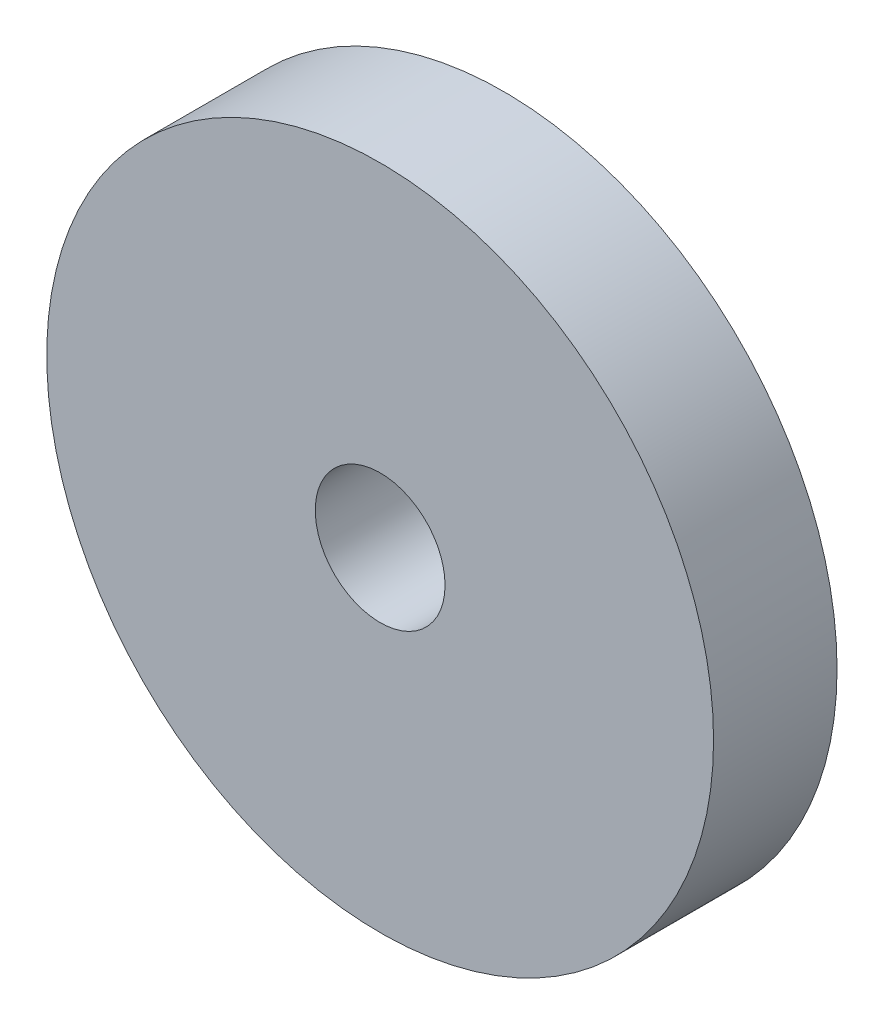
ISO-10303-21;
HEADER;
FILE_DESCRIPTION(('STEP AP214'),'2;1');
FILE_NAME('part.step','',(''),(''),'','','');
FILE_SCHEMA(('AUTOMOTIVE_DESIGN { 1 0 10303 214 1 1 1 1 }'));
ENDSEC;
DATA;
#1=APPLICATION_CONTEXT('core data for automotive mechanical design processes');
#2=APPLICATION_PROTOCOL_DEFINITION('international standard','automotive_design',2000,#1);
#3=PRODUCT_CONTEXT('',#1,'mechanical');
#4=PRODUCT('Part','Part','',(#3));
#5=PRODUCT_RELATED_PRODUCT_CATEGORY('part','',(#4));
#6=PRODUCT_DEFINITION_FORMATION('','',#4);
#7=PRODUCT_DEFINITION_CONTEXT('part definition',#1,'design');
#8=PRODUCT_DEFINITION('design','',#6,#7);
#9=PRODUCT_DEFINITION_SHAPE('','',#8);
#10=(LENGTH_UNIT() NAMED_UNIT(*) SI_UNIT(.MILLI.,.METRE.));
#11=(NAMED_UNIT(*) PLANE_ANGLE_UNIT() SI_UNIT($,.RADIAN.));
#12=(NAMED_UNIT(*) SI_UNIT($,.STERADIAN.) SOLID_ANGLE_UNIT());
#13=UNCERTAINTY_MEASURE_WITH_UNIT(LENGTH_MEASURE(1.E-05),#10,'distance_accuracy_value','');
#14=(GEOMETRIC_REPRESENTATION_CONTEXT(3) GLOBAL_UNCERTAINTY_ASSIGNED_CONTEXT((#13)) GLOBAL_UNIT_ASSIGNED_CONTEXT((#10,
#11,#12)) REPRESENTATION_CONTEXT('',''));
#15=CARTESIAN_POINT('',(0.,0.,0.));
#16=DIRECTION('',(0.,0.,1.));
#17=DIRECTION('',(1.,0.,0.));
#18=AXIS2_PLACEMENT_3D('',#15,#16,#17);
#19=CARTESIAN_POINT('',(0.,0.,5.));
#20=DIRECTION('',(0.,0.,-1.));
#21=DIRECTION('',(-1.,0.,0.));
#22=AXIS2_PLACEMENT_3D('',#19,#20,#21);
#23=CYLINDRICAL_SURFACE('',#22,13.5);
#24=CARTESIAN_POINT('',(0.,0.,5.));
#25=DIRECTION('',(0.,0.,1.));
#26=DIRECTION('',(1.,0.,0.));
#27=AXIS2_PLACEMENT_3D('',#24,#25,#26);
#28=CIRCLE('',#27,13.5);
#29=CARTESIAN_POINT('',(13.5,0.,5.));
#30=VERTEX_POINT('',#29);
#31=EDGE_CURVE('E10',#30,#30,#28,.T.);
#32=ORIENTED_EDGE('',*,*,#31,.F.);
#33=EDGE_LOOP('',(#32));
#34=FACE_BOUND('',#33,.T.);
#35=CARTESIAN_POINT('',(0.,0.,0.));
#36=DIRECTION('',(0.,0.,1.));
#37=DIRECTION('',(1.,0.,0.));
#38=AXIS2_PLACEMENT_3D('',#35,#36,#37);
#39=CIRCLE('',#38,13.5);
#40=CARTESIAN_POINT('',(13.5,0.,0.));
#41=VERTEX_POINT('',#40);
#42=EDGE_CURVE('E46',#41,#41,#39,.T.);
#43=ORIENTED_EDGE('',*,*,#42,.T.);
#44=EDGE_LOOP('',(#43));
#45=FACE_BOUND('',#44,.T.);
#46=ADVANCED_FACE('F43',(#34,#45),#23,.T.);
#47=CARTESIAN_POINT('',(0.,0.,5.));
#48=DIRECTION('',(0.,0.,1.));
#49=DIRECTION('',(1.,0.,0.));
#50=AXIS2_PLACEMENT_3D('',#47,#48,#49);
#51=PLANE('',#50);
#52=CARTESIAN_POINT('',(0.,0.,5.));
#53=DIRECTION('',(0.,0.,1.));
#54=DIRECTION('',(1.,0.,0.));
#55=AXIS2_PLACEMENT_3D('',#52,#53,#54);
#56=CIRCLE('',#55,2.627);
#57=CARTESIAN_POINT('',(2.627,0.,5.));
#58=VERTEX_POINT('',#57);
#59=EDGE_CURVE('E57',#58,#58,#56,.T.);
#60=ORIENTED_EDGE('',*,*,#59,.F.);
#61=EDGE_LOOP('',(#60));
#62=FACE_BOUND('',#61,.T.);
#63=ORIENTED_EDGE('',*,*,#31,.T.);
#64=EDGE_LOOP('',(#63));
#65=FACE_BOUND('',#64,.T.);
#66=ADVANCED_FACE('F74',(#62,#65),#51,.T.);
#67=CARTESIAN_POINT('',(0.,0.,0.));
#68=DIRECTION('',(0.,0.,1.));
#69=DIRECTION('',(1.,0.,0.));
#70=AXIS2_PLACEMENT_3D('',#67,#68,#69);
#71=PLANE('',#70);
#72=CARTESIAN_POINT('',(0.,0.,0.));
#73=DIRECTION('',(0.,0.,1.));
#74=DIRECTION('',(1.,0.,0.));
#75=AXIS2_PLACEMENT_3D('',#72,#73,#74);
#76=CIRCLE('',#75,2.627);
#77=CARTESIAN_POINT('',(2.627,0.,0.));
#78=VERTEX_POINT('',#77);
#79=EDGE_CURVE('E55',#78,#78,#76,.T.);
#80=ORIENTED_EDGE('',*,*,#79,.T.);
#81=EDGE_LOOP('',(#80));
#82=FACE_BOUND('',#81,.T.);
#83=ORIENTED_EDGE('',*,*,#42,.F.);
#84=EDGE_LOOP('',(#83));
#85=FACE_BOUND('',#84,.T.);
#86=ADVANCED_FACE('F65',(#82,#85),#71,.F.);
#87=CARTESIAN_POINT('',(0.,0.,0.));
#88=DIRECTION('',(0.,0.,1.));
#89=DIRECTION('',(1.,0.,0.));
#90=AXIS2_PLACEMENT_3D('',#87,#88,#89);
#91=CYLINDRICAL_SURFACE('',#90,2.627);
#92=ORIENTED_EDGE('',*,*,#79,.F.);
#93=EDGE_LOOP('',(#92));
#94=FACE_BOUND('',#93,.T.);
#95=ORIENTED_EDGE('',*,*,#59,.T.);
#96=EDGE_LOOP('',(#95));
#97=FACE_BOUND('',#96,.T.);
#98=ADVANCED_FACE('F68',(#94,#97),#91,.F.);
#99=CLOSED_SHELL('',(#46,#66,#86,#98));
#100=MANIFOLD_SOLID_BREP('B2',#99);
#101=ADVANCED_BREP_SHAPE_REPRESENTATION('',(#18,#100),#14);
#102=SHAPE_DEFINITION_REPRESENTATION(#9,#101);
ENDSEC;
END-ISO-10303-21;
